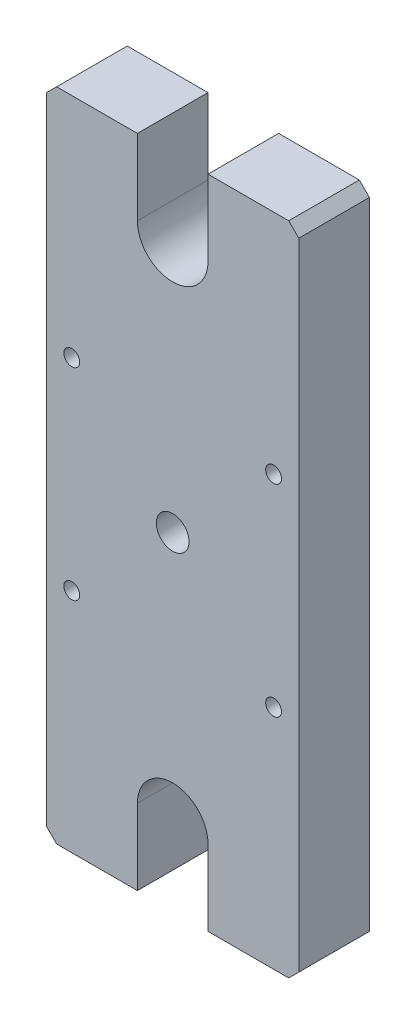
ISO-10303-21;
HEADER;
FILE_DESCRIPTION(('STEP AP214'),'2;1');
FILE_NAME('part.step','',(''),(''),'','','');
FILE_SCHEMA(('AUTOMOTIVE_DESIGN { 1 0 10303 214 1 1 1 1 }'));
ENDSEC;
DATA;
#1=APPLICATION_CONTEXT('core data for automotive mechanical design processes');
#2=APPLICATION_PROTOCOL_DEFINITION('international standard','automotive_design',2000,#1);
#3=PRODUCT_CONTEXT('',#1,'mechanical');
#4=PRODUCT('Part','Part','',(#3));
#5=PRODUCT_RELATED_PRODUCT_CATEGORY('part','',(#4));
#6=PRODUCT_DEFINITION_FORMATION('','',#4);
#7=PRODUCT_DEFINITION_CONTEXT('part definition',#1,'design');
#8=PRODUCT_DEFINITION('design','',#6,#7);
#9=PRODUCT_DEFINITION_SHAPE('','',#8);
#10=(LENGTH_UNIT() NAMED_UNIT(*) SI_UNIT(.MILLI.,.METRE.));
#11=(NAMED_UNIT(*) PLANE_ANGLE_UNIT() SI_UNIT($,.RADIAN.));
#12=(NAMED_UNIT(*) SI_UNIT($,.STERADIAN.) SOLID_ANGLE_UNIT());
#13=UNCERTAINTY_MEASURE_WITH_UNIT(LENGTH_MEASURE(1.E-05),#10,'distance_accuracy_value','');
#14=(GEOMETRIC_REPRESENTATION_CONTEXT(3) GLOBAL_UNCERTAINTY_ASSIGNED_CONTEXT((#13)) GLOBAL_UNIT_ASSIGNED_CONTEXT((#10,
#11,#12)) REPRESENTATION_CONTEXT('',''));
#15=CARTESIAN_POINT('',(0.,0.,0.));
#16=DIRECTION('',(0.,0.,1.));
#17=DIRECTION('',(1.,0.,0.));
#18=AXIS2_PLACEMENT_3D('',#15,#16,#17);
#19=CARTESIAN_POINT('',(-12.5,32.5,0.));
#20=DIRECTION('',(0.,1.,0.));
#21=DIRECTION('',(1.,0.,0.));
#22=AXIS2_PLACEMENT_3D('',#19,#20,#21);
#23=PLANE('',#22);
#24=DIRECTION('',(0.,0.,1.));
#25=VECTOR('',#24,1.);
#26=CARTESIAN_POINT('',(11.5,32.5,0.));
#27=LINE('',#26,#25);
#28=CARTESIAN_POINT('',(11.5,32.5,0.));
#29=VERTEX_POINT('',#28);
#30=CARTESIAN_POINT('',(11.5,32.5,7.));
#31=VERTEX_POINT('',#30);
#32=EDGE_CURVE('E219',#29,#31,#27,.T.);
#33=ORIENTED_EDGE('',*,*,#32,.F.);
#34=DIRECTION('',(1.,0.,0.));
#35=VECTOR('',#34,1.);
#36=CARTESIAN_POINT('',(3.5,32.5,0.));
#37=LINE('',#36,#35);
#38=CARTESIAN_POINT('',(3.5,32.5,0.));
#39=VERTEX_POINT('',#38);
#40=EDGE_CURVE('E236',#39,#29,#37,.T.);
#41=ORIENTED_EDGE('',*,*,#40,.F.);
#42=DIRECTION('',(0.,0.,1.));
#43=VECTOR('',#42,1.);
#44=CARTESIAN_POINT('',(3.5,32.5,0.));
#45=LINE('',#44,#43);
#46=CARTESIAN_POINT('',(3.5,32.5,7.));
#47=VERTEX_POINT('',#46);
#48=EDGE_CURVE('E335',#39,#47,#45,.T.);
#49=ORIENTED_EDGE('',*,*,#48,.T.);
#50=DIRECTION('',(1.,0.,0.));
#51=VECTOR('',#50,1.);
#52=CARTESIAN_POINT('',(3.5,32.5,7.));
#53=LINE('',#52,#51);
#54=EDGE_CURVE('E10',#47,#31,#53,.T.);
#55=ORIENTED_EDGE('',*,*,#54,.T.);
#56=EDGE_LOOP('',(#33,#41,#49,#55));
#57=FACE_BOUND('',#56,.T.);
#58=ADVANCED_FACE('F16',(#57),#23,.T.);
#59=CARTESIAN_POINT('',(0.,0.,7.));
#60=DIRECTION('',(0.,0.,1.));
#61=DIRECTION('',(1.,0.,0.));
#62=AXIS2_PLACEMENT_3D('',#59,#60,#61);
#63=PLANE('',#62);
#64=CARTESIAN_POINT('',(0.,0.,7.));
#65=DIRECTION('',(0.,0.,-1.));
#66=DIRECTION('',(1.,0.,0.));
#67=AXIS2_PLACEMENT_3D('',#64,#65,#66);
#68=CIRCLE('',#67,1.621);
#69=CARTESIAN_POINT('',(1.621,0.,7.));
#70=VERTEX_POINT('',#69);
#71=EDGE_CURVE('E326',#70,#70,#68,.T.);
#72=ORIENTED_EDGE('',*,*,#71,.T.);
#73=EDGE_LOOP('',(#72));
#74=FACE_BOUND('',#73,.T.);
#75=CARTESIAN_POINT('',(10.,10.,7.));
#76=DIRECTION('',(0.,0.,-1.));
#77=DIRECTION('',(1.,0.,0.));
#78=AXIS2_PLACEMENT_3D('',#75,#76,#77);
#79=CIRCLE('',#78,0.7835);
#80=CARTESIAN_POINT('',(10.7835,10.,7.));
#81=VERTEX_POINT('',#80);
#82=EDGE_CURVE('E323',#81,#81,#79,.T.);
#83=ORIENTED_EDGE('',*,*,#82,.T.);
#84=EDGE_LOOP('',(#83));
#85=FACE_BOUND('',#84,.T.);
#86=CARTESIAN_POINT('',(-10.,10.,7.));
#87=DIRECTION('',(0.,0.,-1.));
#88=DIRECTION('',(1.,0.,0.));
#89=AXIS2_PLACEMENT_3D('',#86,#87,#88);
#90=CIRCLE('',#89,0.7835);
#91=CARTESIAN_POINT('',(-9.2165,10.,7.));
#92=VERTEX_POINT('',#91);
#93=EDGE_CURVE('E320',#92,#92,#90,.T.);
#94=ORIENTED_EDGE('',*,*,#93,.T.);
#95=EDGE_LOOP('',(#94));
#96=FACE_BOUND('',#95,.T.);
#97=CARTESIAN_POINT('',(10.,-10.,7.));
#98=DIRECTION('',(0.,0.,-1.));
#99=DIRECTION('',(1.,0.,0.));
#100=AXIS2_PLACEMENT_3D('',#97,#98,#99);
#101=CIRCLE('',#100,0.7835);
#102=CARTESIAN_POINT('',(10.7835,-10.,7.));
#103=VERTEX_POINT('',#102);
#104=EDGE_CURVE('E317',#103,#103,#101,.T.);
#105=ORIENTED_EDGE('',*,*,#104,.T.);
#106=EDGE_LOOP('',(#105));
#107=FACE_BOUND('',#106,.T.);
#108=CARTESIAN_POINT('',(-10.,-10.,7.));
#109=DIRECTION('',(0.,0.,-1.));
#110=DIRECTION('',(1.,0.,0.));
#111=AXIS2_PLACEMENT_3D('',#108,#109,#110);
#112=CIRCLE('',#111,0.7835);
#113=CARTESIAN_POINT('',(-9.2165,-10.,7.));
#114=VERTEX_POINT('',#113);
#115=EDGE_CURVE('E314',#114,#114,#112,.T.);
#116=ORIENTED_EDGE('',*,*,#115,.T.);
#117=EDGE_LOOP('',(#116));
#118=FACE_BOUND('',#117,.T.);
#119=DIRECTION('',(-0.707106781186548,0.707106781186548,0.));
#120=VECTOR('',#119,1.);
#121=CARTESIAN_POINT('',(-11.5,-32.5,7.));
#122=LINE('',#121,#120);
#123=CARTESIAN_POINT('',(-11.5,-32.5,7.));
#124=VERTEX_POINT('',#123);
#125=CARTESIAN_POINT('',(-12.5,-31.5,7.));
#126=VERTEX_POINT('',#125);
#127=EDGE_CURVE('E379',#124,#126,#122,.T.);
#128=ORIENTED_EDGE('',*,*,#127,.F.);
#129=DIRECTION('',(-1.,0.,0.));
#130=VECTOR('',#129,1.);
#131=CARTESIAN_POINT('',(-3.5,-32.5,7.));
#132=LINE('',#131,#130);
#133=CARTESIAN_POINT('',(-3.5,-32.5,7.));
#134=VERTEX_POINT('',#133);
#135=EDGE_CURVE('E24',#134,#124,#132,.T.);
#136=ORIENTED_EDGE('',*,*,#135,.F.);
#137=DIRECTION('',(0.,1.,0.));
#138=VECTOR('',#137,1.);
#139=CARTESIAN_POINT('',(-3.5,-32.5,7.));
#140=LINE('',#139,#138);
#141=CARTESIAN_POINT('',(-3.5,-25.,7.));
#142=VERTEX_POINT('',#141);
#143=EDGE_CURVE('E345',#134,#142,#140,.T.);
#144=ORIENTED_EDGE('',*,*,#143,.T.);
#145=CARTESIAN_POINT('',(0.,-25.,7.));
#146=DIRECTION('',(0.,0.,-1.));
#147=DIRECTION('',(1.,1.28214556E-07,0.));
#148=AXIS2_PLACEMENT_3D('',#145,#146,#147);
#149=CIRCLE('',#148,3.5);
#150=CARTESIAN_POINT('',(3.5,-24.9999995512491,7.));
#151=VERTEX_POINT('',#150);
#152=EDGE_CURVE('E356',#142,#151,#149,.T.);
#153=ORIENTED_EDGE('',*,*,#152,.T.);
#154=DIRECTION('',(0.,-1.,0.));
#155=VECTOR('',#154,1.);
#156=CARTESIAN_POINT('',(3.5,-24.9999995512491,7.));
#157=LINE('',#156,#155);
#158=CARTESIAN_POINT('',(3.5,-32.5,7.));
#159=VERTEX_POINT('',#158);
#160=EDGE_CURVE('E45',#151,#159,#157,.T.);
#161=ORIENTED_EDGE('',*,*,#160,.T.);
#162=DIRECTION('',(-1.,0.,0.));
#163=VECTOR('',#162,1.);
#164=CARTESIAN_POINT('',(11.5,-32.5,7.));
#165=LINE('',#164,#163);
#166=CARTESIAN_POINT('',(11.5,-32.5,7.));
#167=VERTEX_POINT('',#166);
#168=EDGE_CURVE('E36',#167,#159,#165,.T.);
#169=ORIENTED_EDGE('',*,*,#168,.F.);
#170=DIRECTION('',(-0.707106781186549,-0.707106781186546,0.));
#171=VECTOR('',#170,1.);
#172=CARTESIAN_POINT('',(12.5,-31.5,7.));
#173=LINE('',#172,#171);
#174=CARTESIAN_POINT('',(12.5,-31.5,7.));
#175=VERTEX_POINT('',#174);
#176=EDGE_CURVE('E271',#175,#167,#173,.T.);
#177=ORIENTED_EDGE('',*,*,#176,.F.);
#178=DIRECTION('',(0.,-1.,0.));
#179=VECTOR('',#178,1.);
#180=CARTESIAN_POINT('',(12.5,31.5,7.));
#181=LINE('',#180,#179);
#182=CARTESIAN_POINT('',(12.5,31.5,7.));
#183=VERTEX_POINT('',#182);
#184=EDGE_CURVE('E272',#183,#175,#181,.T.);
#185=ORIENTED_EDGE('',*,*,#184,.F.);
#186=DIRECTION('',(0.707106781186548,-0.707106781186548,0.));
#187=VECTOR('',#186,1.);
#188=CARTESIAN_POINT('',(11.5,32.5,7.));
#189=LINE('',#188,#187);
#190=EDGE_CURVE('E215',#31,#183,#189,.T.);
#191=ORIENTED_EDGE('',*,*,#190,.F.);
#192=ORIENTED_EDGE('',*,*,#54,.F.);
#193=DIRECTION('',(0.,-1.,0.));
#194=VECTOR('',#193,1.);
#195=CARTESIAN_POINT('',(3.5,32.5,7.));
#196=LINE('',#195,#194);
#197=CARTESIAN_POINT('',(3.5,25.,7.));
#198=VERTEX_POINT('',#197);
#199=EDGE_CURVE('E332',#47,#198,#196,.T.);
#200=ORIENTED_EDGE('',*,*,#199,.T.);
#201=CARTESIAN_POINT('',(0.,25.,7.));
#202=DIRECTION('',(0.,0.,-1.));
#203=DIRECTION('',(-1.,0.,0.));
#204=AXIS2_PLACEMENT_3D('',#201,#202,#203);
#205=CIRCLE('',#204,3.5);
#206=CARTESIAN_POINT('',(-3.5,25.,7.));
#207=VERTEX_POINT('',#206);
#208=EDGE_CURVE('E301',#198,#207,#205,.T.);
#209=ORIENTED_EDGE('',*,*,#208,.T.);
#210=DIRECTION('',(0.,1.,0.));
#211=VECTOR('',#210,1.);
#212=CARTESIAN_POINT('',(-3.5,25.,7.));
#213=LINE('',#212,#211);
#214=CARTESIAN_POINT('',(-3.5,32.5,7.));
#215=VERTEX_POINT('',#214);
#216=EDGE_CURVE('E302',#207,#215,#213,.T.);
#217=ORIENTED_EDGE('',*,*,#216,.T.);
#218=DIRECTION('',(1.,0.,0.));
#219=VECTOR('',#218,1.);
#220=CARTESIAN_POINT('',(-11.5,32.5,7.));
#221=LINE('',#220,#219);
#222=CARTESIAN_POINT('',(-11.5,32.5,7.));
#223=VERTEX_POINT('',#222);
#224=EDGE_CURVE('E340',#223,#215,#221,.T.);
#225=ORIENTED_EDGE('',*,*,#224,.F.);
#226=DIRECTION('',(0.707106781186549,0.707106781186546,0.));
#227=VECTOR('',#226,1.);
#228=CARTESIAN_POINT('',(-12.5,31.5,7.));
#229=LINE('',#228,#227);
#230=CARTESIAN_POINT('',(-12.5,31.5,7.));
#231=VERTEX_POINT('',#230);
#232=EDGE_CURVE('E257',#231,#223,#229,.T.);
#233=ORIENTED_EDGE('',*,*,#232,.F.);
#234=DIRECTION('',(0.,1.,0.));
#235=VECTOR('',#234,1.);
#236=CARTESIAN_POINT('',(-12.5,-31.5,7.));
#237=LINE('',#236,#235);
#238=EDGE_CURVE('E258',#126,#231,#237,.T.);
#239=ORIENTED_EDGE('',*,*,#238,.F.);
#240=EDGE_LOOP('',(#128,#136,#144,#153,#161,#169,#177,#185,#191,#192,#200,#209,#217,#225,#233,#239));
#241=FACE_BOUND('',#240,.T.);
#242=ADVANCED_FACE('F804',(#74,#85,#96,#107,#118,#241),#63,.T.);
#243=CARTESIAN_POINT('',(12.5,-32.5,0.));
#244=DIRECTION('',(0.,-1.,0.));
#245=DIRECTION('',(0.,0.,-1.));
#246=AXIS2_PLACEMENT_3D('',#243,#244,#245);
#247=PLANE('',#246);
#248=DIRECTION('',(0.,0.,1.));
#249=VECTOR('',#248,1.);
#250=CARTESIAN_POINT('',(-11.5,-32.5,0.));
#251=LINE('',#250,#249);
#252=CARTESIAN_POINT('',(-11.5,-32.5,0.));
#253=VERTEX_POINT('',#252);
#254=EDGE_CURVE('E385',#253,#124,#251,.T.);
#255=ORIENTED_EDGE('',*,*,#254,.F.);
#256=DIRECTION('',(-1.,0.,0.));
#257=VECTOR('',#256,1.);
#258=CARTESIAN_POINT('',(-3.5,-32.5,0.));
#259=LINE('',#258,#257);
#260=CARTESIAN_POINT('',(-3.5,-32.5,0.));
#261=VERTEX_POINT('',#260);
#262=EDGE_CURVE('E268',#261,#253,#259,.T.);
#263=ORIENTED_EDGE('',*,*,#262,.F.);
#264=DIRECTION('',(0.,0.,1.));
#265=VECTOR('',#264,1.);
#266=CARTESIAN_POINT('',(-3.5,-32.5,0.));
#267=LINE('',#266,#265);
#268=EDGE_CURVE('E349',#261,#134,#267,.T.);
#269=ORIENTED_EDGE('',*,*,#268,.T.);
#270=ORIENTED_EDGE('',*,*,#135,.T.);
#271=EDGE_LOOP('',(#255,#263,#269,#270));
#272=FACE_BOUND('',#271,.T.);
#273=ADVANCED_FACE('F625',(#272),#247,.T.);
#274=CARTESIAN_POINT('',(12.5,-32.5,0.));
#275=DIRECTION('',(0.,-1.,0.));
#276=DIRECTION('',(0.,0.,-1.));
#277=AXIS2_PLACEMENT_3D('',#274,#275,#276);
#278=PLANE('',#277);
#279=DIRECTION('',(0.,0.,-1.));
#280=VECTOR('',#279,1.);
#281=CARTESIAN_POINT('',(11.5,-32.5,7.));
#282=LINE('',#281,#280);
#283=CARTESIAN_POINT('',(11.5,-32.5,0.));
#284=VERTEX_POINT('',#283);
#285=EDGE_CURVE('E311',#167,#284,#282,.T.);
#286=ORIENTED_EDGE('',*,*,#285,.F.);
#287=ORIENTED_EDGE('',*,*,#168,.T.);
#288=DIRECTION('',(0.,0.,-1.));
#289=VECTOR('',#288,1.);
#290=CARTESIAN_POINT('',(3.5,-32.5,7.));
#291=LINE('',#290,#289);
#292=CARTESIAN_POINT('',(3.5,-32.5,0.));
#293=VERTEX_POINT('',#292);
#294=EDGE_CURVE('E357',#159,#293,#291,.T.);
#295=ORIENTED_EDGE('',*,*,#294,.T.);
#296=DIRECTION('',(-1.,0.,0.));
#297=VECTOR('',#296,1.);
#298=CARTESIAN_POINT('',(11.5,-32.5,0.));
#299=LINE('',#298,#297);
#300=EDGE_CURVE('E251',#284,#293,#299,.T.);
#301=ORIENTED_EDGE('',*,*,#300,.F.);
#302=EDGE_LOOP('',(#286,#287,#295,#301));
#303=FACE_BOUND('',#302,.T.);
#304=ADVANCED_FACE('F619',(#303),#278,.T.);
#305=CARTESIAN_POINT('',(-12.5,32.5,0.));
#306=DIRECTION('',(0.,1.,0.));
#307=DIRECTION('',(1.,0.,0.));
#308=AXIS2_PLACEMENT_3D('',#305,#306,#307);
#309=PLANE('',#308);
#310=DIRECTION('',(0.,0.,-1.));
#311=VECTOR('',#310,1.);
#312=CARTESIAN_POINT('',(-11.5,32.5,7.));
#313=LINE('',#312,#311);
#314=CARTESIAN_POINT('',(-11.5,32.5,0.));
#315=VERTEX_POINT('',#314);
#316=EDGE_CURVE('E282',#223,#315,#313,.T.);
#317=ORIENTED_EDGE('',*,*,#316,.F.);
#318=ORIENTED_EDGE('',*,*,#224,.T.);
#319=DIRECTION('',(0.,0.,-1.));
#320=VECTOR('',#319,1.);
#321=CARTESIAN_POINT('',(-3.5,32.5,7.));
#322=LINE('',#321,#320);
#323=CARTESIAN_POINT('',(-3.5,32.5,0.));
#324=VERTEX_POINT('',#323);
#325=EDGE_CURVE('E310',#215,#324,#322,.T.);
#326=ORIENTED_EDGE('',*,*,#325,.T.);
#327=DIRECTION('',(1.,0.,0.));
#328=VECTOR('',#327,1.);
#329=CARTESIAN_POINT('',(-11.5,32.5,0.));
#330=LINE('',#329,#328);
#331=EDGE_CURVE('E405',#315,#324,#330,.T.);
#332=ORIENTED_EDGE('',*,*,#331,.F.);
#333=EDGE_LOOP('',(#317,#318,#326,#332));
#334=FACE_BOUND('',#333,.T.);
#335=ADVANCED_FACE('F624',(#334),#309,.T.);
#336=CARTESIAN_POINT('',(3.5,-32.5,7.));
#337=DIRECTION('',(1.,0.,0.));
#338=DIRECTION('',(0.,1.,0.));
#339=AXIS2_PLACEMENT_3D('',#336,#337,#338);
#340=PLANE('',#339);
#341=DIRECTION('',(0.,1.,0.));
#342=VECTOR('',#341,1.);
#343=CARTESIAN_POINT('',(3.5,-32.5,0.));
#344=LINE('',#343,#342);
#345=CARTESIAN_POINT('',(3.5,-24.9999995512491,0.));
#346=VERTEX_POINT('',#345);
#347=EDGE_CURVE('E248',#293,#346,#344,.T.);
#348=ORIENTED_EDGE('',*,*,#347,.F.);
#349=ORIENTED_EDGE('',*,*,#294,.F.);
#350=ORIENTED_EDGE('',*,*,#160,.F.);
#351=DIRECTION('',(0.,0.,-1.));
#352=VECTOR('',#351,1.);
#353=CARTESIAN_POINT('',(3.5,-24.9999995512491,7.));
#354=LINE('',#353,#352);
#355=EDGE_CURVE('E353',#151,#346,#354,.T.);
#356=ORIENTED_EDGE('',*,*,#355,.T.);
#357=EDGE_LOOP('',(#348,#349,#350,#356));
#358=FACE_BOUND('',#357,.T.);
#359=ADVANCED_FACE('F776',(#358),#340,.F.);
#360=CARTESIAN_POINT('',(0.,-25.,7.));
#361=DIRECTION('',(0.,0.,-1.));
#362=DIRECTION('',(1.,1.28214556E-07,0.));
#363=AXIS2_PLACEMENT_3D('',#360,#361,#362);
#364=CYLINDRICAL_SURFACE('',#363,3.5);
#365=CARTESIAN_POINT('',(0.,-25.,0.));
#366=DIRECTION('',(0.,0.,1.));
#367=DIRECTION('',(1.,1.28214556E-07,0.));
#368=AXIS2_PLACEMENT_3D('',#365,#366,#367);
#369=CIRCLE('',#368,3.5);
#370=CARTESIAN_POINT('',(-3.5,-25.,0.));
#371=VERTEX_POINT('',#370);
#372=EDGE_CURVE('E247',#346,#371,#369,.T.);
#373=ORIENTED_EDGE('',*,*,#372,.F.);
#374=ORIENTED_EDGE('',*,*,#355,.F.);
#375=ORIENTED_EDGE('',*,*,#152,.F.);
#376=DIRECTION('',(0.,0.,-1.));
#377=VECTOR('',#376,1.);
#378=CARTESIAN_POINT('',(-3.5,-25.,7.));
#379=LINE('',#378,#377);
#380=EDGE_CURVE('E339',#142,#371,#379,.T.);
#381=ORIENTED_EDGE('',*,*,#380,.T.);
#382=EDGE_LOOP('',(#373,#374,#375,#381));
#383=FACE_BOUND('',#382,.T.);
#384=ADVANCED_FACE('F711',(#383),#364,.F.);
#385=CARTESIAN_POINT('',(-3.5,-25.,7.));
#386=DIRECTION('',(-1.,0.,0.));
#387=DIRECTION('',(0.,0.,1.));
#388=AXIS2_PLACEMENT_3D('',#385,#386,#387);
#389=PLANE('',#388);
#390=DIRECTION('',(0.,-1.,0.));
#391=VECTOR('',#390,1.);
#392=CARTESIAN_POINT('',(-3.5,-25.,0.));
#393=LINE('',#392,#391);
#394=EDGE_CURVE('E264',#371,#261,#393,.T.);
#395=ORIENTED_EDGE('',*,*,#394,.F.);
#396=ORIENTED_EDGE('',*,*,#380,.F.);
#397=ORIENTED_EDGE('',*,*,#143,.F.);
#398=ORIENTED_EDGE('',*,*,#268,.F.);
#399=EDGE_LOOP('',(#395,#396,#397,#398));
#400=FACE_BOUND('',#399,.T.);
#401=ADVANCED_FACE('F706',(#400),#389,.F.);
#402=CARTESIAN_POINT('',(3.5,25.,7.));
#403=DIRECTION('',(1.,0.,0.));
#404=DIRECTION('',(0.,1.,0.));
#405=AXIS2_PLACEMENT_3D('',#402,#403,#404);
#406=PLANE('',#405);
#407=DIRECTION('',(0.,1.,0.));
#408=VECTOR('',#407,1.);
#409=CARTESIAN_POINT('',(3.5,25.,0.));
#410=LINE('',#409,#408);
#411=CARTESIAN_POINT('',(3.5,25.,0.));
#412=VERTEX_POINT('',#411);
#413=EDGE_CURVE('E243',#412,#39,#410,.T.);
#414=ORIENTED_EDGE('',*,*,#413,.F.);
#415=DIRECTION('',(0.,0.,-1.));
#416=VECTOR('',#415,1.);
#417=CARTESIAN_POINT('',(3.5,25.,7.));
#418=LINE('',#417,#416);
#419=EDGE_CURVE('E329',#198,#412,#418,.T.);
#420=ORIENTED_EDGE('',*,*,#419,.F.);
#421=ORIENTED_EDGE('',*,*,#199,.F.);
#422=ORIENTED_EDGE('',*,*,#48,.F.);
#423=EDGE_LOOP('',(#414,#420,#421,#422));
#424=FACE_BOUND('',#423,.T.);
#425=ADVANCED_FACE('F432',(#424),#406,.F.);
#426=CARTESIAN_POINT('',(0.,25.,7.));
#427=DIRECTION('',(0.,0.,-1.));
#428=DIRECTION('',(-1.,0.,0.));
#429=AXIS2_PLACEMENT_3D('',#426,#427,#428);
#430=CYLINDRICAL_SURFACE('',#429,3.5);
#431=CARTESIAN_POINT('',(0.,25.,0.));
#432=DIRECTION('',(0.,0.,1.));
#433=DIRECTION('',(-1.,0.,0.));
#434=AXIS2_PLACEMENT_3D('',#431,#432,#433);
#435=CIRCLE('',#434,3.5);
#436=CARTESIAN_POINT('',(-3.5,25.,0.));
#437=VERTEX_POINT('',#436);
#438=EDGE_CURVE('E391',#437,#412,#435,.T.);
#439=ORIENTED_EDGE('',*,*,#438,.F.);
#440=DIRECTION('',(0.,0.,-1.));
#441=VECTOR('',#440,1.);
#442=CARTESIAN_POINT('',(-3.5,25.,7.));
#443=LINE('',#442,#441);
#444=EDGE_CURVE('E298',#207,#437,#443,.T.);
#445=ORIENTED_EDGE('',*,*,#444,.F.);
#446=ORIENTED_EDGE('',*,*,#208,.F.);
#447=ORIENTED_EDGE('',*,*,#419,.T.);
#448=EDGE_LOOP('',(#439,#445,#446,#447));
#449=FACE_BOUND('',#448,.T.);
#450=ADVANCED_FACE('F427',(#449),#430,.F.);
#451=CARTESIAN_POINT('',(-3.5,32.5,7.));
#452=DIRECTION('',(-1.,0.,0.));
#453=DIRECTION('',(0.,0.,1.));
#454=AXIS2_PLACEMENT_3D('',#451,#452,#453);
#455=PLANE('',#454);
#456=DIRECTION('',(0.,-1.,0.));
#457=VECTOR('',#456,1.);
#458=CARTESIAN_POINT('',(-3.5,32.5,0.));
#459=LINE('',#458,#457);
#460=EDGE_CURVE('E395',#324,#437,#459,.T.);
#461=ORIENTED_EDGE('',*,*,#460,.F.);
#462=ORIENTED_EDGE('',*,*,#325,.F.);
#463=ORIENTED_EDGE('',*,*,#216,.F.);
#464=ORIENTED_EDGE('',*,*,#444,.T.);
#465=EDGE_LOOP('',(#461,#462,#463,#464));
#466=FACE_BOUND('',#465,.T.);
#467=ADVANCED_FACE('F422',(#466),#455,.F.);
#468=CARTESIAN_POINT('',(-1.621,0.,7.));
#469=CARTESIAN_POINT('',(-1.621,-1.621,7.00000000000001));
#470=CARTESIAN_POINT('',(0.,-1.621,7.));
#471=CARTESIAN_POINT('',(1.621,-1.621,7.00000000000001));
#472=CARTESIAN_POINT('',(1.621,0.,7.));
#473=CARTESIAN_POINT('',(1.621,1.621,7.00000000000001));
#474=CARTESIAN_POINT('',(0.,1.621,7.));
#475=CARTESIAN_POINT('',(-1.621,1.621,7.00000000000001));
#476=CARTESIAN_POINT('',(-1.621,0.,7.));
#477=CARTESIAN_POINT('',(-1.621,0.,0.));
#478=CARTESIAN_POINT('',(-1.621,-1.621,0.));
#479=CARTESIAN_POINT('',(0.,-1.621,0.));
#480=CARTESIAN_POINT('',(1.621,-1.621,0.));
#481=CARTESIAN_POINT('',(1.621,0.,0.));
#482=CARTESIAN_POINT('',(1.621,1.621,0.));
#483=CARTESIAN_POINT('',(0.,1.621,0.));
#484=CARTESIAN_POINT('',(-1.621,1.621,0.));
#485=CARTESIAN_POINT('',(-1.621,0.,0.));
#486=(BOUNDED_SURFACE() B_SPLINE_SURFACE(1,2,((#468,#469,#470,#471,#472,#473,#474,#475,#476),
(#477,#478,#479,#480,#481,#482,#483,#484,#485)),.UNSPECIFIED.,.F.,.T.,
.F.) B_SPLINE_SURFACE_WITH_KNOTS((2,2),(3,2,2,2,3),(-43.178813558537,-38.8604915350947),(0.,
2.54626084573453,5.09252169146906,7.63878253720358,10.1850433829381),
.UNSPECIFIED.) GEOMETRIC_REPRESENTATION_ITEM() RATIONAL_B_SPLINE_SURFACE(((1.,0.707106781186548,
1.,0.707106781186548,1.,0.707106781186548,1.,0.707106781186548,1.),(1.,0.707106781186548,1.,
0.707106781186548,1.,0.707106781186548,1.,0.707106781186548,1.))) REPRESENTATION_ITEM('') SURFACE());
#487=CARTESIAN_POINT('',(0.,0.,0.));
#488=DIRECTION('',(0.,0.,1.));
#489=DIRECTION('',(1.,0.,0.));
#490=AXIS2_PLACEMENT_3D('',#487,#488,#489);
#491=CIRCLE('',#490,1.621);
#492=CARTESIAN_POINT('',(-1.621,0.,0.));
#493=VERTEX_POINT('',#492);
#494=EDGE_CURVE('E291',#493,#493,#491,.T.);
#495=ORIENTED_EDGE('',*,*,#71,.F.);
#496=EDGE_LOOP('',(#495));
#497=FACE_BOUND('',#496,.T.);
#498=ORIENTED_EDGE('',*,*,#494,.F.);
#499=EDGE_LOOP('',(#498));
#500=FACE_BOUND('',#499,.T.);
#501=ADVANCED_FACE('F610',(#497,#500),#486,.F.);
#502=CARTESIAN_POINT('',(9.2165,10.,7.));
#503=CARTESIAN_POINT('',(9.2165,9.2165,7.00000000000001));
#504=CARTESIAN_POINT('',(10.,9.2165,7.));
#505=CARTESIAN_POINT('',(10.7835,9.2165,7.00000000000001));
#506=CARTESIAN_POINT('',(10.7835,10.,7.));
#507=CARTESIAN_POINT('',(10.7835,10.7835,7.00000000000001));
#508=CARTESIAN_POINT('',(10.,10.7835,7.));
#509=CARTESIAN_POINT('',(9.2165,10.7835,7.00000000000001));
#510=CARTESIAN_POINT('',(9.2165,10.,7.));
#511=CARTESIAN_POINT('',(9.2165,10.,0.));
#512=CARTESIAN_POINT('',(9.2165,9.2165,0.));
#513=CARTESIAN_POINT('',(10.,9.2165,0.));
#514=CARTESIAN_POINT('',(10.7835,9.2165,0.));
#515=CARTESIAN_POINT('',(10.7835,10.,0.));
#516=CARTESIAN_POINT('',(10.7835,10.7835,0.));
#517=CARTESIAN_POINT('',(10.,10.7835,0.));
#518=CARTESIAN_POINT('',(9.2165,10.7835,0.));
#519=CARTESIAN_POINT('',(9.2165,10.,0.));
#520=(BOUNDED_SURFACE() B_SPLINE_SURFACE(1,2,((#502,#503,#504,#505,#506,#507,#508,#509,#510),
(#511,#512,#513,#514,#515,#516,#517,#518,#519)),.UNSPECIFIED.,.F.,.T.,
.F.) B_SPLINE_SURFACE_WITH_KNOTS((2,2),(3,2,2,2,3),(-89.333575977522,-80.3993066731186),(0.,
1.2307189220438,2.4614378440876,3.69215676613141,4.92287568817521),
.UNSPECIFIED.) GEOMETRIC_REPRESENTATION_ITEM() RATIONAL_B_SPLINE_SURFACE(((1.,0.707106781186548,
1.,0.707106781186548,1.,0.707106781186548,1.,0.707106781186548,1.),(1.,0.707106781186548,1.,
0.707106781186548,1.,0.707106781186548,1.,0.707106781186548,1.))) REPRESENTATION_ITEM('') SURFACE());
#521=CARTESIAN_POINT('',(10.,10.,0.));
#522=DIRECTION('',(0.,0.,1.));
#523=DIRECTION('',(1.,0.,0.));
#524=AXIS2_PLACEMENT_3D('',#521,#522,#523);
#525=CIRCLE('',#524,0.7835);
#526=CARTESIAN_POINT('',(9.2165,10.,0.));
#527=VERTEX_POINT('',#526);
#528=EDGE_CURVE('E288',#527,#527,#525,.T.);
#529=ORIENTED_EDGE('',*,*,#82,.F.);
#530=EDGE_LOOP('',(#529));
#531=FACE_BOUND('',#530,.T.);
#532=ORIENTED_EDGE('',*,*,#528,.F.);
#533=EDGE_LOOP('',(#532));
#534=FACE_BOUND('',#533,.T.);
#535=ADVANCED_FACE('F604',(#531,#534),#520,.F.);
#536=CARTESIAN_POINT('',(-10.7835,10.,7.));
#537=CARTESIAN_POINT('',(-10.7835,9.2165,7.00000000000001));
#538=CARTESIAN_POINT('',(-10.,9.2165,7.));
#539=CARTESIAN_POINT('',(-9.2165,9.2165,7.00000000000001));
#540=CARTESIAN_POINT('',(-9.2165,10.,7.));
#541=CARTESIAN_POINT('',(-9.2165,10.7835,7.00000000000001));
#542=CARTESIAN_POINT('',(-10.,10.7835,7.));
#543=CARTESIAN_POINT('',(-10.7835,10.7835,7.00000000000001));
#544=CARTESIAN_POINT('',(-10.7835,10.,7.));
#545=CARTESIAN_POINT('',(-10.7835,10.,0.));
#546=CARTESIAN_POINT('',(-10.7835,9.2165,0.));
#547=CARTESIAN_POINT('',(-10.,9.2165,0.));
#548=CARTESIAN_POINT('',(-9.2165,9.2165,0.));
#549=CARTESIAN_POINT('',(-9.2165,10.,0.));
#550=CARTESIAN_POINT('',(-9.2165,10.7835,0.));
#551=CARTESIAN_POINT('',(-10.,10.7835,0.));
#552=CARTESIAN_POINT('',(-10.7835,10.7835,0.));
#553=CARTESIAN_POINT('',(-10.7835,10.,0.));
#554=(BOUNDED_SURFACE() B_SPLINE_SURFACE(1,2,((#536,#537,#538,#539,#540,#541,#542,#543,#544),
(#545,#546,#547,#548,#549,#550,#551,#552,#553)),.UNSPECIFIED.,.F.,.T.,
.F.) B_SPLINE_SURFACE_WITH_KNOTS((2,2),(3,2,2,2,3),(-89.333575977522,-80.3993066731186),(0.,
1.2307189220438,2.4614378440876,3.69215676613141,4.92287568817521),
.UNSPECIFIED.) GEOMETRIC_REPRESENTATION_ITEM() RATIONAL_B_SPLINE_SURFACE(((1.,0.707106781186548,
1.,0.707106781186548,1.,0.707106781186548,1.,0.707106781186548,1.),(1.,0.707106781186548,1.,
0.707106781186548,1.,0.707106781186548,1.,0.707106781186548,1.))) REPRESENTATION_ITEM('') SURFACE());
#555=CARTESIAN_POINT('',(-10.,10.,0.));
#556=DIRECTION('',(0.,0.,1.));
#557=DIRECTION('',(1.,0.,0.));
#558=AXIS2_PLACEMENT_3D('',#555,#556,#557);
#559=CIRCLE('',#558,0.7835);
#560=CARTESIAN_POINT('',(-10.7835,10.,0.));
#561=VERTEX_POINT('',#560);
#562=EDGE_CURVE('E285',#561,#561,#559,.T.);
#563=ORIENTED_EDGE('',*,*,#93,.F.);
#564=EDGE_LOOP('',(#563));
#565=FACE_BOUND('',#564,.T.);
#566=ORIENTED_EDGE('',*,*,#562,.F.);
#567=EDGE_LOOP('',(#566));
#568=FACE_BOUND('',#567,.T.);
#569=ADVANCED_FACE('F609',(#565,#568),#554,.F.);
#570=CARTESIAN_POINT('',(9.2165,-10.,7.));
#571=CARTESIAN_POINT('',(9.2165,-10.7835,7.00000000000001));
#572=CARTESIAN_POINT('',(10.,-10.7835,7.));
#573=CARTESIAN_POINT('',(10.7835,-10.7835,7.00000000000001));
#574=CARTESIAN_POINT('',(10.7835,-10.,7.));
#575=CARTESIAN_POINT('',(10.7835,-9.2165,7.00000000000001));
#576=CARTESIAN_POINT('',(10.,-9.2165,7.));
#577=CARTESIAN_POINT('',(9.2165,-9.2165,7.00000000000001));
#578=CARTESIAN_POINT('',(9.2165,-10.,7.));
#579=CARTESIAN_POINT('',(9.2165,-10.,0.));
#580=CARTESIAN_POINT('',(9.2165,-10.7835,0.));
#581=CARTESIAN_POINT('',(10.,-10.7835,0.));
#582=CARTESIAN_POINT('',(10.7835,-10.7835,0.));
#583=CARTESIAN_POINT('',(10.7835,-10.,0.));
#584=CARTESIAN_POINT('',(10.7835,-9.2165,0.));
#585=CARTESIAN_POINT('',(10.,-9.2165,0.));
#586=CARTESIAN_POINT('',(9.2165,-9.2165,0.));
#587=CARTESIAN_POINT('',(9.2165,-10.,0.));
#588=(BOUNDED_SURFACE() B_SPLINE_SURFACE(1,2,((#570,#571,#572,#573,#574,#575,#576,#577,#578),
(#579,#580,#581,#582,#583,#584,#585,#586,#587)),.UNSPECIFIED.,.F.,.T.,
.F.) B_SPLINE_SURFACE_WITH_KNOTS((2,2),(3,2,2,2,3),(-89.333575977522,-80.3993066731186),(0.,
1.2307189220438,2.4614378440876,3.69215676613141,4.92287568817521),
.UNSPECIFIED.) GEOMETRIC_REPRESENTATION_ITEM() RATIONAL_B_SPLINE_SURFACE(((1.,0.707106781186548,
1.,0.707106781186548,1.,0.707106781186548,1.,0.707106781186548,1.),(1.,0.707106781186548,1.,
0.707106781186548,1.,0.707106781186548,1.,0.707106781186548,1.))) REPRESENTATION_ITEM('') SURFACE());
#589=CARTESIAN_POINT('',(10.,-10.,0.));
#590=DIRECTION('',(0.,0.,1.));
#591=DIRECTION('',(1.,0.,0.));
#592=AXIS2_PLACEMENT_3D('',#589,#590,#591);
#593=CIRCLE('',#592,0.7835);
#594=CARTESIAN_POINT('',(9.2165,-10.,0.));
#595=VERTEX_POINT('',#594);
#596=EDGE_CURVE('E278',#595,#595,#593,.T.);
#597=ORIENTED_EDGE('',*,*,#104,.F.);
#598=EDGE_LOOP('',(#597));
#599=FACE_BOUND('',#598,.T.);
#600=ORIENTED_EDGE('',*,*,#596,.F.);
#601=EDGE_LOOP('',(#600));
#602=FACE_BOUND('',#601,.T.);
#603=ADVANCED_FACE('F671',(#599,#602),#588,.F.);
#604=CARTESIAN_POINT('',(-10.7835,-10.,7.));
#605=CARTESIAN_POINT('',(-10.7835,-10.7835,7.00000000000001));
#606=CARTESIAN_POINT('',(-10.,-10.7835,7.));
#607=CARTESIAN_POINT('',(-9.2165,-10.7835,7.00000000000001));
#608=CARTESIAN_POINT('',(-9.2165,-10.,7.));
#609=CARTESIAN_POINT('',(-9.2165,-9.2165,7.00000000000001));
#610=CARTESIAN_POINT('',(-10.,-9.2165,7.));
#611=CARTESIAN_POINT('',(-10.7835,-9.2165,7.00000000000001));
#612=CARTESIAN_POINT('',(-10.7835,-10.,7.));
#613=CARTESIAN_POINT('',(-10.7835,-10.,0.));
#614=CARTESIAN_POINT('',(-10.7835,-10.7835,0.));
#615=CARTESIAN_POINT('',(-10.,-10.7835,0.));
#616=CARTESIAN_POINT('',(-9.2165,-10.7835,0.));
#617=CARTESIAN_POINT('',(-9.2165,-10.,0.));
#618=CARTESIAN_POINT('',(-9.2165,-9.2165,0.));
#619=CARTESIAN_POINT('',(-10.,-9.2165,0.));
#620=CARTESIAN_POINT('',(-10.7835,-9.2165,0.));
#621=CARTESIAN_POINT('',(-10.7835,-10.,0.));
#622=(BOUNDED_SURFACE() B_SPLINE_SURFACE(1,2,((#604,#605,#606,#607,#608,#609,#610,#611,#612),
(#613,#614,#615,#616,#617,#618,#619,#620,#621)),.UNSPECIFIED.,.F.,.T.,
.F.) B_SPLINE_SURFACE_WITH_KNOTS((2,2),(3,2,2,2,3),(-89.333575977522,-80.3993066731186),(0.,
1.2307189220438,2.4614378440876,3.69215676613141,4.92287568817521),
.UNSPECIFIED.) GEOMETRIC_REPRESENTATION_ITEM() RATIONAL_B_SPLINE_SURFACE(((1.,0.707106781186548,
1.,0.707106781186548,1.,0.707106781186548,1.,0.707106781186548,1.),(1.,0.707106781186548,1.,
0.707106781186548,1.,0.707106781186548,1.,0.707106781186548,1.))) REPRESENTATION_ITEM('') SURFACE());
#623=CARTESIAN_POINT('',(-10.,-10.,0.));
#624=DIRECTION('',(0.,0.,1.));
#625=DIRECTION('',(1.,0.,0.));
#626=AXIS2_PLACEMENT_3D('',#623,#624,#625);
#627=CIRCLE('',#626,0.7835);
#628=CARTESIAN_POINT('',(-10.7835,-10.,0.));
#629=VERTEX_POINT('',#628);
#630=EDGE_CURVE('E275',#629,#629,#627,.T.);
#631=ORIENTED_EDGE('',*,*,#115,.F.);
#632=EDGE_LOOP('',(#631));
#633=FACE_BOUND('',#632,.T.);
#634=ORIENTED_EDGE('',*,*,#630,.F.);
#635=EDGE_LOOP('',(#634));
#636=FACE_BOUND('',#635,.T.);
#637=ADVANCED_FACE('F665',(#633,#636),#622,.F.);
#638=CARTESIAN_POINT('',(12.,-32.,0.));
#639=DIRECTION('',(0.707106781186546,-0.707106781186549,0.));
#640=DIRECTION('',(0.,0.,-1.));
#641=AXIS2_PLACEMENT_3D('',#638,#639,#640);
#642=PLANE('',#641);
#643=ORIENTED_EDGE('',*,*,#176,.T.);
#644=ORIENTED_EDGE('',*,*,#285,.T.);
#645=DIRECTION('',(0.707106781186549,0.707106781186546,0.));
#646=VECTOR('',#645,1.);
#647=CARTESIAN_POINT('',(11.5,-32.5,0.));
#648=LINE('',#647,#646);
#649=CARTESIAN_POINT('',(12.5,-31.5,0.));
#650=VERTEX_POINT('',#649);
#651=EDGE_CURVE('E230',#284,#650,#648,.T.);
#652=ORIENTED_EDGE('',*,*,#651,.T.);
#653=DIRECTION('',(0.,0.,1.));
#654=VECTOR('',#653,1.);
#655=CARTESIAN_POINT('',(12.5,-31.5,0.));
#656=LINE('',#655,#654);
#657=EDGE_CURVE('E225',#650,#175,#656,.T.);
#658=ORIENTED_EDGE('',*,*,#657,.T.);
#659=EDGE_LOOP('',(#643,#644,#652,#658));
#660=FACE_BOUND('',#659,.T.);
#661=ADVANCED_FACE('F670',(#660),#642,.T.);
#662=CARTESIAN_POINT('',(12.5,32.5,0.));
#663=DIRECTION('',(1.,0.,0.));
#664=DIRECTION('',(0.,1.,0.));
#665=AXIS2_PLACEMENT_3D('',#662,#663,#664);
#666=PLANE('',#665);
#667=DIRECTION('',(0.,0.,-1.));
#668=VECTOR('',#667,1.);
#669=CARTESIAN_POINT('',(12.5,31.5,7.));
#670=LINE('',#669,#668);
#671=CARTESIAN_POINT('',(12.5,31.5,0.));
#672=VERTEX_POINT('',#671);
#673=EDGE_CURVE('E207',#183,#672,#670,.T.);
#674=ORIENTED_EDGE('',*,*,#673,.F.);
#675=ORIENTED_EDGE('',*,*,#184,.T.);
#676=ORIENTED_EDGE('',*,*,#657,.F.);
#677=DIRECTION('',(0.,-1.,0.));
#678=VECTOR('',#677,1.);
#679=CARTESIAN_POINT('',(12.5,31.5,0.));
#680=LINE('',#679,#678);
#681=EDGE_CURVE('E222',#672,#650,#680,.T.);
#682=ORIENTED_EDGE('',*,*,#681,.F.);
#683=EDGE_LOOP('',(#674,#675,#676,#682));
#684=FACE_BOUND('',#683,.T.);
#685=ADVANCED_FACE('F223',(#684),#666,.T.);
#686=CARTESIAN_POINT('',(12.,32.,0.));
#687=DIRECTION('',(0.707106781186548,0.707106781186548,0.));
#688=DIRECTION('',(0.,0.,-1.));
#689=AXIS2_PLACEMENT_3D('',#686,#687,#688);
#690=PLANE('',#689);
#691=ORIENTED_EDGE('',*,*,#190,.T.);
#692=ORIENTED_EDGE('',*,*,#673,.T.);
#693=DIRECTION('',(-0.707106781186548,0.707106781186548,0.));
#694=VECTOR('',#693,1.);
#695=CARTESIAN_POINT('',(12.5,31.5,0.));
#696=LINE('',#695,#694);
#697=EDGE_CURVE('E212',#672,#29,#696,.T.);
#698=ORIENTED_EDGE('',*,*,#697,.T.);
#699=ORIENTED_EDGE('',*,*,#32,.T.);
#700=EDGE_LOOP('',(#691,#692,#698,#699));
#701=FACE_BOUND('',#700,.T.);
#702=ADVANCED_FACE('F209',(#701),#690,.T.);
#703=CARTESIAN_POINT('',(-12.,32.,0.));
#704=DIRECTION('',(-0.707106781186546,0.707106781186549,0.));
#705=DIRECTION('',(0.,0.,1.));
#706=AXIS2_PLACEMENT_3D('',#703,#704,#705);
#707=PLANE('',#706);
#708=ORIENTED_EDGE('',*,*,#232,.T.);
#709=ORIENTED_EDGE('',*,*,#316,.T.);
#710=DIRECTION('',(-0.707106781186549,-0.707106781186546,0.));
#711=VECTOR('',#710,1.);
#712=CARTESIAN_POINT('',(-11.5,32.5,0.));
#713=LINE('',#712,#711);
#714=CARTESIAN_POINT('',(-12.5,31.5,0.));
#715=VERTEX_POINT('',#714);
#716=EDGE_CURVE('E399',#315,#715,#713,.T.);
#717=ORIENTED_EDGE('',*,*,#716,.T.);
#718=DIRECTION('',(0.,0.,1.));
#719=VECTOR('',#718,1.);
#720=CARTESIAN_POINT('',(-12.5,31.5,0.));
#721=LINE('',#720,#719);
#722=EDGE_CURVE('E253',#715,#231,#721,.T.);
#723=ORIENTED_EDGE('',*,*,#722,.T.);
#724=EDGE_LOOP('',(#708,#709,#717,#723));
#725=FACE_BOUND('',#724,.T.);
#726=ADVANCED_FACE('F647',(#725),#707,.T.);
#727=CARTESIAN_POINT('',(-12.5,-32.5,0.));
#728=DIRECTION('',(-1.,0.,0.));
#729=DIRECTION('',(0.,0.,1.));
#730=AXIS2_PLACEMENT_3D('',#727,#728,#729);
#731=PLANE('',#730);
#732=DIRECTION('',(0.,0.,-1.));
#733=VECTOR('',#732,1.);
#734=CARTESIAN_POINT('',(-12.5,-31.5,7.));
#735=LINE('',#734,#733);
#736=CARTESIAN_POINT('',(-12.5,-31.5,0.));
#737=VERTEX_POINT('',#736);
#738=EDGE_CURVE('E374',#126,#737,#735,.T.);
#739=ORIENTED_EDGE('',*,*,#738,.F.);
#740=ORIENTED_EDGE('',*,*,#238,.T.);
#741=ORIENTED_EDGE('',*,*,#722,.F.);
#742=DIRECTION('',(0.,1.,0.));
#743=VECTOR('',#742,1.);
#744=CARTESIAN_POINT('',(-12.5,-31.5,0.));
#745=LINE('',#744,#743);
#746=EDGE_CURVE('E388',#737,#715,#745,.T.);
#747=ORIENTED_EDGE('',*,*,#746,.F.);
#748=EDGE_LOOP('',(#739,#740,#741,#747));
#749=FACE_BOUND('',#748,.T.);
#750=ADVANCED_FACE('F636',(#749),#731,.T.);
#751=CARTESIAN_POINT('',(0.,0.,0.));
#752=DIRECTION('',(0.,0.,1.));
#753=DIRECTION('',(1.,0.,0.));
#754=AXIS2_PLACEMENT_3D('',#751,#752,#753);
#755=PLANE('',#754);
#756=ORIENTED_EDGE('',*,*,#494,.T.);
#757=EDGE_LOOP('',(#756));
#758=FACE_BOUND('',#757,.T.);
#759=ORIENTED_EDGE('',*,*,#528,.T.);
#760=EDGE_LOOP('',(#759));
#761=FACE_BOUND('',#760,.T.);
#762=ORIENTED_EDGE('',*,*,#562,.T.);
#763=EDGE_LOOP('',(#762));
#764=FACE_BOUND('',#763,.T.);
#765=ORIENTED_EDGE('',*,*,#596,.T.);
#766=EDGE_LOOP('',(#765));
#767=FACE_BOUND('',#766,.T.);
#768=ORIENTED_EDGE('',*,*,#630,.T.);
#769=EDGE_LOOP('',(#768));
#770=FACE_BOUND('',#769,.T.);
#771=DIRECTION('',(0.707106781186548,-0.707106781186548,0.));
#772=VECTOR('',#771,1.);
#773=CARTESIAN_POINT('',(-12.5,-31.5,0.));
#774=LINE('',#773,#772);
#775=EDGE_CURVE('E378',#737,#253,#774,.T.);
#776=ORIENTED_EDGE('',*,*,#775,.F.);
#777=ORIENTED_EDGE('',*,*,#746,.T.);
#778=ORIENTED_EDGE('',*,*,#716,.F.);
#779=ORIENTED_EDGE('',*,*,#331,.T.);
#780=ORIENTED_EDGE('',*,*,#460,.T.);
#781=ORIENTED_EDGE('',*,*,#438,.T.);
#782=ORIENTED_EDGE('',*,*,#413,.T.);
#783=ORIENTED_EDGE('',*,*,#40,.T.);
#784=ORIENTED_EDGE('',*,*,#697,.F.);
#785=ORIENTED_EDGE('',*,*,#681,.T.);
#786=ORIENTED_EDGE('',*,*,#651,.F.);
#787=ORIENTED_EDGE('',*,*,#300,.T.);
#788=ORIENTED_EDGE('',*,*,#347,.T.);
#789=ORIENTED_EDGE('',*,*,#372,.T.);
#790=ORIENTED_EDGE('',*,*,#394,.T.);
#791=ORIENTED_EDGE('',*,*,#262,.T.);
#792=EDGE_LOOP('',(#776,#777,#778,#779,#780,#781,#782,#783,#784,#785,#786,#787,#788,#789,#790,#791));
#793=FACE_BOUND('',#792,.T.);
#794=ADVANCED_FACE('F233',(#758,#761,#764,#767,#770,#793),#755,.F.);
#795=CARTESIAN_POINT('',(-12.,-32.,0.));
#796=DIRECTION('',(-0.707106781186548,-0.707106781186548,0.));
#797=DIRECTION('',(-0.707106781186548,0.707106781186548,0.));
#798=AXIS2_PLACEMENT_3D('',#795,#796,#797);
#799=PLANE('',#798);
#800=ORIENTED_EDGE('',*,*,#127,.T.);
#801=ORIENTED_EDGE('',*,*,#738,.T.);
#802=ORIENTED_EDGE('',*,*,#775,.T.);
#803=ORIENTED_EDGE('',*,*,#254,.T.);
#804=EDGE_LOOP('',(#800,#801,#802,#803));
#805=FACE_BOUND('',#804,.T.);
#806=ADVANCED_FACE('F590',(#805),#799,.T.);
#807=CLOSED_SHELL('',(#58,#242,#273,#304,#335,#359,#384,#401,#425,#450,#467,#501,#535,#569,#603,
#637,#661,#685,#702,#726,#750,#794,#806));
#808=MANIFOLD_SOLID_BREP('B1',#807);
#809=ADVANCED_BREP_SHAPE_REPRESENTATION('',(#18,#808),#14);
#810=SHAPE_DEFINITION_REPRESENTATION(#9,#809);
ENDSEC;
END-ISO-10303-21;
